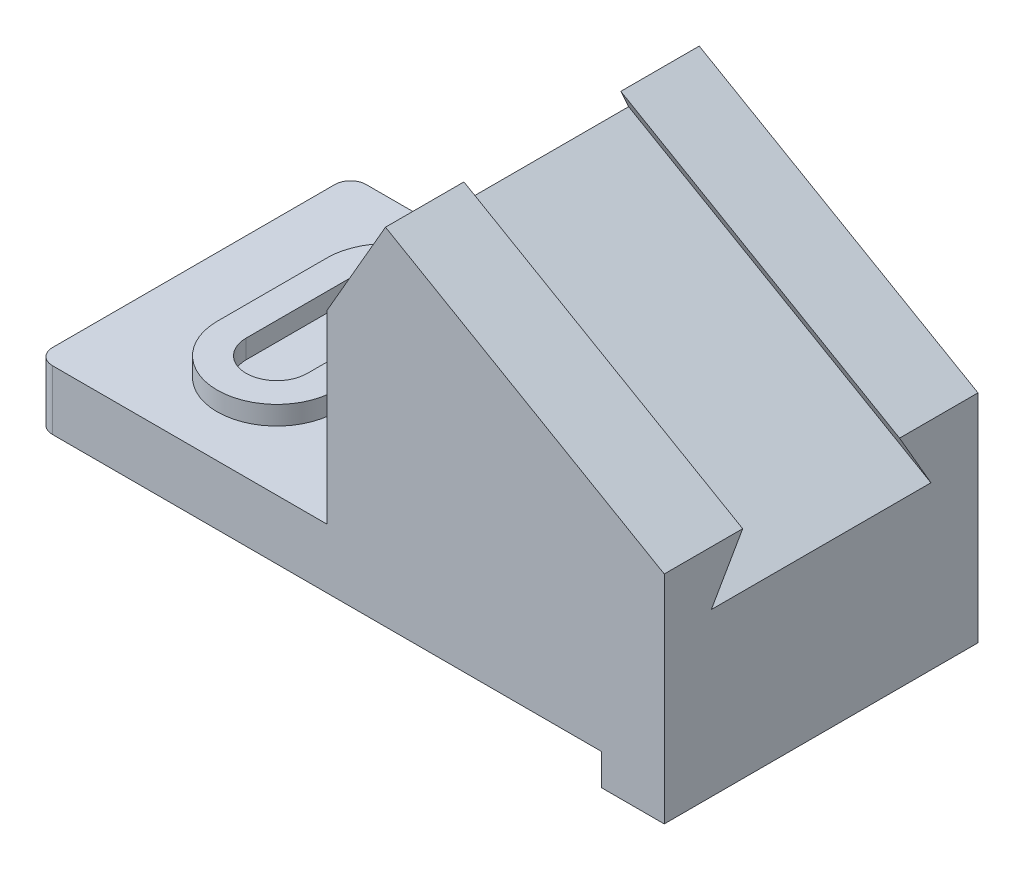
ISO-10303-21;
HEADER;
FILE_DESCRIPTION(('STEP AP214'),'2;1');
FILE_NAME('part.step','',(''),(''),'','','');
FILE_SCHEMA(('AUTOMOTIVE_DESIGN { 1 0 10303 214 1 1 1 1 }'));
ENDSEC;
DATA;
#1=APPLICATION_CONTEXT('core data for automotive mechanical design processes');
#2=APPLICATION_PROTOCOL_DEFINITION('international standard','automotive_design',2000,#1);
#3=PRODUCT_CONTEXT('',#1,'mechanical');
#4=PRODUCT('Part','Part','',(#3));
#5=PRODUCT_RELATED_PRODUCT_CATEGORY('part','',(#4));
#6=PRODUCT_DEFINITION_FORMATION('','',#4);
#7=PRODUCT_DEFINITION_CONTEXT('part definition',#1,'design');
#8=PRODUCT_DEFINITION('design','',#6,#7);
#9=PRODUCT_DEFINITION_SHAPE('','',#8);
#10=(LENGTH_UNIT() NAMED_UNIT(*) SI_UNIT(.MILLI.,.METRE.));
#11=(NAMED_UNIT(*) PLANE_ANGLE_UNIT() SI_UNIT($,.RADIAN.));
#12=(NAMED_UNIT(*) SI_UNIT($,.STERADIAN.) SOLID_ANGLE_UNIT());
#13=UNCERTAINTY_MEASURE_WITH_UNIT(LENGTH_MEASURE(1.E-05),#10,'distance_accuracy_value','');
#14=(GEOMETRIC_REPRESENTATION_CONTEXT(3) GLOBAL_UNCERTAINTY_ASSIGNED_CONTEXT((#13)) GLOBAL_UNIT_ASSIGNED_CONTEXT((#10,
#11,#12)) REPRESENTATION_CONTEXT('',''));
#15=CARTESIAN_POINT('',(0.,0.,0.));
#16=DIRECTION('',(0.,0.,1.));
#17=DIRECTION('',(1.,0.,0.));
#18=AXIS2_PLACEMENT_3D('',#15,#16,#17);
#19=CARTESIAN_POINT('',(185.,38.,200.));
#20=DIRECTION('',(0.,-1.,0.));
#21=DIRECTION('',(1.,0.,0.));
#22=AXIS2_PLACEMENT_3D('',#19,#20,#21);
#23=PLANE('',#22);
#24=DIRECTION('',(-1.,0.,0.));
#25=VECTOR('',#24,1.);
#26=CARTESIAN_POINT('',(185.,38.,0.));
#27=LINE('',#26,#25);
#28=CARTESIAN_POINT('',(185.,38.,0.));
#29=VERTEX_POINT('',#28);
#30=CARTESIAN_POINT('',(10.,38.,0.));
#31=VERTEX_POINT('',#30);
#32=EDGE_CURVE('E338',#29,#31,#27,.T.);
#33=ORIENTED_EDGE('',*,*,#32,.T.);
#34=CARTESIAN_POINT('',(10.,38.,10.));
#35=DIRECTION('',(0.,-1.,0.));
#36=DIRECTION('',(1.,0.,0.));
#37=AXIS2_PLACEMENT_3D('',#34,#35,#36);
#38=CIRCLE('',#37,10.);
#39=CARTESIAN_POINT('',(0.,38.,10.));
#40=VERTEX_POINT('',#39);
#41=EDGE_CURVE('E56',#31,#40,#38,.F.);
#42=ORIENTED_EDGE('',*,*,#41,.T.);
#43=DIRECTION('',(0.,0.,-1.));
#44=VECTOR('',#43,1.);
#45=CARTESIAN_POINT('',(0.,38.,200.));
#46=LINE('',#45,#44);
#47=CARTESIAN_POINT('',(0.,38.,190.));
#48=VERTEX_POINT('',#47);
#49=EDGE_CURVE('E360',#48,#40,#46,.T.);
#50=ORIENTED_EDGE('',*,*,#49,.F.);
#51=CARTESIAN_POINT('',(10.,38.,190.));
#52=DIRECTION('',(0.,-1.,0.));
#53=DIRECTION('',(1.,0.,0.));
#54=AXIS2_PLACEMENT_3D('',#51,#52,#53);
#55=CIRCLE('',#54,10.);
#56=CARTESIAN_POINT('',(10.,38.,200.));
#57=VERTEX_POINT('',#56);
#58=EDGE_CURVE('E439',#48,#57,#55,.F.);
#59=ORIENTED_EDGE('',*,*,#58,.T.);
#60=DIRECTION('',(-1.,0.,0.));
#61=VECTOR('',#60,1.);
#62=CARTESIAN_POINT('',(185.,38.,200.));
#63=LINE('',#62,#61);
#64=CARTESIAN_POINT('',(185.,38.,200.));
#65=VERTEX_POINT('',#64);
#66=EDGE_CURVE('E356',#65,#57,#63,.T.);
#67=ORIENTED_EDGE('',*,*,#66,.F.);
#68=DIRECTION('',(0.,0.,-1.));
#69=VECTOR('',#68,1.);
#70=CARTESIAN_POINT('',(185.,38.,200.));
#71=LINE('',#70,#69);
#72=EDGE_CURVE('E389',#65,#29,#71,.T.);
#73=ORIENTED_EDGE('',*,*,#72,.T.);
#74=EDGE_LOOP('',(#33,#42,#50,#59,#67,#73));
#75=FACE_BOUND('',#74,.T.);
#76=CARTESIAN_POINT('',(88.,38.,135.));
#77=DIRECTION('',(0.,1.,0.));
#78=DIRECTION('',(-1.,0.,0.));
#79=AXIS2_PLACEMENT_3D('',#76,#77,#78);
#80=CIRCLE('',#79,38.);
#81=CARTESIAN_POINT('',(50.,38.,135.));
#82=VERTEX_POINT('',#81);
#83=CARTESIAN_POINT('',(126.,38.,135.));
#84=VERTEX_POINT('',#83);
#85=EDGE_CURVE('E222',#82,#84,#80,.T.);
#86=ORIENTED_EDGE('',*,*,#85,.F.);
#87=DIRECTION('',(0.,0.,1.));
#88=VECTOR('',#87,1.);
#89=CARTESIAN_POINT('',(50.,38.,135.));
#90=LINE('',#89,#88);
#91=CARTESIAN_POINT('',(50.,38.,65.));
#92=VERTEX_POINT('',#91);
#93=EDGE_CURVE('E263',#92,#82,#90,.T.);
#94=ORIENTED_EDGE('',*,*,#93,.F.);
#95=CARTESIAN_POINT('',(87.999999999999,38.,64.9999912642141));
#96=DIRECTION('',(0.,1.,0.));
#97=DIRECTION('',(-1.,0.,0.));
#98=AXIS2_PLACEMENT_3D('',#95,#96,#97);
#99=CIRCLE('',#98,38.);
#100=CARTESIAN_POINT('',(125.999999999999,38.,64.9999912642141));
#101=VERTEX_POINT('',#100);
#102=EDGE_CURVE('E68',#101,#92,#99,.T.);
#103=ORIENTED_EDGE('',*,*,#102,.F.);
#104=DIRECTION('',(0.,0.,-1.));
#105=VECTOR('',#104,1.);
#106=CARTESIAN_POINT('',(126.,38.,135.));
#107=LINE('',#106,#105);
#108=EDGE_CURVE('E63',#84,#101,#107,.T.);
#109=ORIENTED_EDGE('',*,*,#108,.F.);
#110=EDGE_LOOP('',(#86,#94,#103,#109));
#111=FACE_BOUND('',#110,.T.);
#112=ADVANCED_FACE('F47',(#75,#111),#23,.F.);
#113=CARTESIAN_POINT('',(400.,118.,200.));
#114=DIRECTION('',(-0.499999999999998,-0.86602540378444,0.));
#115=DIRECTION('',(0.86602540378444,-0.499999999999998,0.));
#116=AXIS2_PLACEMENT_3D('',#113,#114,#115);
#117=PLANE('',#116);
#118=DIRECTION('',(0.,0.,-1.));
#119=VECTOR('',#118,1.);
#120=CARTESIAN_POINT('',(222.295517328095,220.597730906827,200.));
#121=LINE('',#120,#119);
#122=CARTESIAN_POINT('',(222.295517328095,220.597730906827,50.));
#123=VERTEX_POINT('',#122);
#124=CARTESIAN_POINT('',(222.295517328095,220.597730906827,0.));
#125=VERTEX_POINT('',#124);
#126=EDGE_CURVE('E397',#123,#125,#121,.T.);
#127=ORIENTED_EDGE('',*,*,#126,.F.);
#128=DIRECTION('',(-0.86602540378444,0.499999999999998,0.));
#129=VECTOR('',#128,1.);
#130=CARTESIAN_POINT('',(459.755752861126,83.5000000000004,50.));
#131=LINE('',#130,#129);
#132=CARTESIAN_POINT('',(400.,118.,50.));
#133=VERTEX_POINT('',#132);
#134=EDGE_CURVE('E308',#133,#123,#131,.T.);
#135=ORIENTED_EDGE('',*,*,#134,.F.);
#136=DIRECTION('',(0.,0.,-1.));
#137=VECTOR('',#136,1.);
#138=CARTESIAN_POINT('',(400.,118.,200.));
#139=LINE('',#138,#137);
#140=CARTESIAN_POINT('',(400.,118.,0.));
#141=VERTEX_POINT('',#140);
#142=EDGE_CURVE('E402',#133,#141,#139,.T.);
#143=ORIENTED_EDGE('',*,*,#142,.T.);
#144=DIRECTION('',(-0.86602540378444,0.499999999999998,0.));
#145=VECTOR('',#144,1.);
#146=CARTESIAN_POINT('',(400.,118.,0.));
#147=LINE('',#146,#145);
#148=EDGE_CURVE('E373',#141,#125,#147,.T.);
#149=ORIENTED_EDGE('',*,*,#148,.T.);
#150=EDGE_LOOP('',(#127,#135,#143,#149));
#151=FACE_BOUND('',#150,.T.);
#152=ADVANCED_FACE('F499',(#151),#117,.F.);
#153=CARTESIAN_POINT('',(0.,38.,200.));
#154=DIRECTION('',(1.,0.,0.));
#155=DIRECTION('',(0.,1.,0.));
#156=AXIS2_PLACEMENT_3D('',#153,#154,#155);
#157=PLANE('',#156);
#158=ORIENTED_EDGE('',*,*,#49,.T.);
#159=DIRECTION('',(0.,-1.,0.));
#160=VECTOR('',#159,1.);
#161=CARTESIAN_POINT('',(0.,38.,10.));
#162=LINE('',#161,#160);
#163=CARTESIAN_POINT('',(0.,0.,10.));
#164=VERTEX_POINT('',#163);
#165=EDGE_CURVE('E426',#40,#164,#162,.T.);
#166=ORIENTED_EDGE('',*,*,#165,.T.);
#167=DIRECTION('',(0.,0.,-1.));
#168=VECTOR('',#167,1.);
#169=CARTESIAN_POINT('',(0.,0.,200.));
#170=LINE('',#169,#168);
#171=CARTESIAN_POINT('',(0.,0.,190.));
#172=VERTEX_POINT('',#171);
#173=EDGE_CURVE('E419',#172,#164,#170,.T.);
#174=ORIENTED_EDGE('',*,*,#173,.F.);
#175=DIRECTION('',(0.,-1.,0.));
#176=VECTOR('',#175,1.);
#177=CARTESIAN_POINT('',(0.,38.,190.));
#178=LINE('',#177,#176);
#179=EDGE_CURVE('E423',#172,#48,#178,.F.);
#180=ORIENTED_EDGE('',*,*,#179,.T.);
#181=EDGE_LOOP('',(#158,#166,#174,#180));
#182=FACE_BOUND('',#181,.T.);
#183=ADVANCED_FACE('F453',(#182),#157,.F.);
#184=CARTESIAN_POINT('',(0.,0.,200.));
#185=DIRECTION('',(0.,1.,0.));
#186=DIRECTION('',(0.,0.,1.));
#187=AXIS2_PLACEMENT_3D('',#184,#185,#186);
#188=PLANE('',#187);
#189=ORIENTED_EDGE('',*,*,#173,.T.);
#190=CARTESIAN_POINT('',(10.,0.,10.));
#191=DIRECTION('',(0.,1.,0.));
#192=DIRECTION('',(0.,0.,1.));
#193=AXIS2_PLACEMENT_3D('',#190,#191,#192);
#194=CIRCLE('',#193,10.);
#195=CARTESIAN_POINT('',(10.,0.,0.));
#196=VERTEX_POINT('',#195);
#197=EDGE_CURVE('E433',#164,#196,#194,.F.);
#198=ORIENTED_EDGE('',*,*,#197,.T.);
#199=DIRECTION('',(1.,0.,0.));
#200=VECTOR('',#199,1.);
#201=CARTESIAN_POINT('',(0.,0.,0.));
#202=LINE('',#201,#200);
#203=CARTESIAN_POINT('',(360.,0.,0.));
#204=VERTEX_POINT('',#203);
#205=EDGE_CURVE('E333',#196,#204,#202,.T.);
#206=ORIENTED_EDGE('',*,*,#205,.T.);
#207=DIRECTION('',(0.,0.,-1.));
#208=VECTOR('',#207,1.);
#209=CARTESIAN_POINT('',(360.,0.,200.));
#210=LINE('',#209,#208);
#211=CARTESIAN_POINT('',(360.,0.,200.));
#212=VERTEX_POINT('',#211);
#213=EDGE_CURVE('E415',#212,#204,#210,.T.);
#214=ORIENTED_EDGE('',*,*,#213,.F.);
#215=DIRECTION('',(1.,0.,0.));
#216=VECTOR('',#215,1.);
#217=CARTESIAN_POINT('',(0.,0.,200.));
#218=LINE('',#217,#216);
#219=CARTESIAN_POINT('',(10.,0.,200.));
#220=VERTEX_POINT('',#219);
#221=EDGE_CURVE('E334',#220,#212,#218,.T.);
#222=ORIENTED_EDGE('',*,*,#221,.F.);
#223=CARTESIAN_POINT('',(10.,0.,190.));
#224=DIRECTION('',(0.,1.,0.));
#225=DIRECTION('',(0.,0.,1.));
#226=AXIS2_PLACEMENT_3D('',#223,#224,#225);
#227=CIRCLE('',#226,10.);
#228=EDGE_CURVE('E430',#220,#172,#227,.F.);
#229=ORIENTED_EDGE('',*,*,#228,.T.);
#230=EDGE_LOOP('',(#189,#198,#206,#214,#222,#229));
#231=FACE_BOUND('',#230,.T.);
#232=ADVANCED_FACE('F459',(#231),#188,.F.);
#233=CARTESIAN_POINT('',(360.,0.,200.));
#234=DIRECTION('',(1.,0.,0.));
#235=DIRECTION('',(0.,0.,-1.));
#236=AXIS2_PLACEMENT_3D('',#233,#234,#235);
#237=PLANE('',#236);
#238=DIRECTION('',(0.,-1.,0.));
#239=VECTOR('',#238,1.);
#240=CARTESIAN_POINT('',(360.,0.,0.));
#241=LINE('',#240,#239);
#242=CARTESIAN_POINT('',(360.,-19.9999999999999,0.));
#243=VERTEX_POINT('',#242);
#244=EDGE_CURVE('E363',#204,#243,#241,.T.);
#245=ORIENTED_EDGE('',*,*,#244,.T.);
#246=DIRECTION('',(0.,0.,-1.));
#247=VECTOR('',#246,1.);
#248=CARTESIAN_POINT('',(360.,-19.9999999999999,200.));
#249=LINE('',#248,#247);
#250=CARTESIAN_POINT('',(360.,-19.9999999999999,200.));
#251=VERTEX_POINT('',#250);
#252=EDGE_CURVE('E411',#251,#243,#249,.T.);
#253=ORIENTED_EDGE('',*,*,#252,.F.);
#254=DIRECTION('',(0.,-1.,0.));
#255=VECTOR('',#254,1.);
#256=CARTESIAN_POINT('',(360.,0.,200.));
#257=LINE('',#256,#255);
#258=EDGE_CURVE('E337',#212,#251,#257,.T.);
#259=ORIENTED_EDGE('',*,*,#258,.F.);
#260=ORIENTED_EDGE('',*,*,#213,.T.);
#261=EDGE_LOOP('',(#245,#253,#259,#260));
#262=FACE_BOUND('',#261,.T.);
#263=ADVANCED_FACE('F468',(#262),#237,.F.);
#264=CARTESIAN_POINT('',(360.,-19.9999999999999,200.));
#265=DIRECTION('',(0.,1.,0.));
#266=DIRECTION('',(0.,0.,1.));
#267=AXIS2_PLACEMENT_3D('',#264,#265,#266);
#268=PLANE('',#267);
#269=DIRECTION('',(1.,0.,0.));
#270=VECTOR('',#269,1.);
#271=CARTESIAN_POINT('',(360.,-19.9999999999999,0.));
#272=LINE('',#271,#270);
#273=CARTESIAN_POINT('',(400.,-19.9999999999999,0.));
#274=VERTEX_POINT('',#273);
#275=EDGE_CURVE('E366',#243,#274,#272,.T.);
#276=ORIENTED_EDGE('',*,*,#275,.T.);
#277=DIRECTION('',(0.,0.,-1.));
#278=VECTOR('',#277,1.);
#279=CARTESIAN_POINT('',(400.,-19.9999999999999,200.));
#280=LINE('',#279,#278);
#281=CARTESIAN_POINT('',(400.,-19.9999999999999,200.));
#282=VERTEX_POINT('',#281);
#283=EDGE_CURVE('E407',#282,#274,#280,.T.);
#284=ORIENTED_EDGE('',*,*,#283,.F.);
#285=DIRECTION('',(1.,0.,0.));
#286=VECTOR('',#285,1.);
#287=CARTESIAN_POINT('',(360.,-19.9999999999999,200.));
#288=LINE('',#287,#286);
#289=EDGE_CURVE('E341',#251,#282,#288,.T.);
#290=ORIENTED_EDGE('',*,*,#289,.F.);
#291=ORIENTED_EDGE('',*,*,#252,.T.);
#292=EDGE_LOOP('',(#276,#284,#290,#291));
#293=FACE_BOUND('',#292,.T.);
#294=ADVANCED_FACE('F472',(#293),#268,.F.);
#295=CARTESIAN_POINT('',(400.,-19.9999999999999,200.));
#296=DIRECTION('',(-1.,0.,0.));
#297=DIRECTION('',(0.,0.,1.));
#298=AXIS2_PLACEMENT_3D('',#295,#296,#297);
#299=PLANE('',#298);
#300=ORIENTED_EDGE('',*,*,#142,.F.);
#301=DIRECTION('',(0.,-0.866025403784438,-0.500000000000002));
#302=VECTOR('',#301,1.);
#303=CARTESIAN_POINT('',(400.,79.4519052838334,27.7442471388738));
#304=LINE('',#303,#302);
#305=CARTESIAN_POINT('',(400.,83.3589838486227,30.));
#306=VERTEX_POINT('',#305);
#307=EDGE_CURVE('E329',#133,#306,#304,.T.);
#308=ORIENTED_EDGE('',*,*,#307,.T.);
#309=DIRECTION('',(0.,0.,1.));
#310=VECTOR('',#309,1.);
#311=CARTESIAN_POINT('',(400.,83.3589838486227,200.));
#312=LINE('',#311,#310);
#313=CARTESIAN_POINT('',(400.,83.3589838486227,170.));
#314=VERTEX_POINT('',#313);
#315=EDGE_CURVE('E311',#306,#314,#312,.T.);
#316=ORIENTED_EDGE('',*,*,#315,.T.);
#317=DIRECTION('',(0.,0.866025403784438,-0.500000000000001));
#318=VECTOR('',#317,1.);
#319=CARTESIAN_POINT('',(400.,-7.15063509461077,222.255752861126));
#320=LINE('',#319,#318);
#321=CARTESIAN_POINT('',(400.,118.,150.));
#322=VERTEX_POINT('',#321);
#323=EDGE_CURVE('E325',#314,#322,#320,.T.);
#324=ORIENTED_EDGE('',*,*,#323,.T.);
#325=CARTESIAN_POINT('',(400.,118.,200.));
#326=VERTEX_POINT('',#325);
#327=EDGE_CURVE('E403',#326,#322,#139,.T.);
#328=ORIENTED_EDGE('',*,*,#327,.F.);
#329=DIRECTION('',(0.,1.,0.));
#330=VECTOR('',#329,1.);
#331=CARTESIAN_POINT('',(400.,-19.9999999999999,200.));
#332=LINE('',#331,#330);
#333=EDGE_CURVE('E344',#282,#326,#332,.T.);
#334=ORIENTED_EDGE('',*,*,#333,.F.);
#335=ORIENTED_EDGE('',*,*,#283,.T.);
#336=DIRECTION('',(0.,1.,0.));
#337=VECTOR('',#336,1.);
#338=CARTESIAN_POINT('',(400.,-19.9999999999999,0.));
#339=LINE('',#338,#337);
#340=EDGE_CURVE('E369',#274,#141,#339,.T.);
#341=ORIENTED_EDGE('',*,*,#340,.T.);
#342=EDGE_LOOP('',(#300,#308,#316,#324,#328,#334,#335,#341));
#343=FACE_BOUND('',#342,.T.);
#344=ADVANCED_FACE('F503',(#343),#299,.F.);
#345=ORIENTED_EDGE('',*,*,#327,.T.);
#346=DIRECTION('',(-0.86602540378444,0.499999999999998,0.));
#347=VECTOR('',#346,1.);
#348=CARTESIAN_POINT('',(459.755752861126,83.5000000000005,150.));
#349=LINE('',#348,#347);
#350=CARTESIAN_POINT('',(222.295517328096,220.597730906827,150.));
#351=VERTEX_POINT('',#350);
#352=EDGE_CURVE('E312',#322,#351,#349,.T.);
#353=ORIENTED_EDGE('',*,*,#352,.T.);
#354=CARTESIAN_POINT('',(222.295517328095,220.597730906827,200.));
#355=VERTEX_POINT('',#354);
#356=EDGE_CURVE('E398',#355,#351,#121,.T.);
#357=ORIENTED_EDGE('',*,*,#356,.F.);
#358=DIRECTION('',(-0.86602540378444,0.499999999999998,0.));
#359=VECTOR('',#358,1.);
#360=CARTESIAN_POINT('',(400.,118.,200.));
#361=LINE('',#360,#359);
#362=EDGE_CURVE('E347',#326,#355,#361,.T.);
#363=ORIENTED_EDGE('',*,*,#362,.F.);
#364=EDGE_LOOP('',(#345,#353,#357,#363));
#365=FACE_BOUND('',#364,.T.);
#366=ADVANCED_FACE('F507',(#365),#117,.F.);
#367=CARTESIAN_POINT('',(222.295517328095,220.597730906827,200.));
#368=DIRECTION('',(0.86602540378444,-0.499999999999997,0.));
#369=DIRECTION('',(0.499999999999997,0.86602540378444,0.));
#370=AXIS2_PLACEMENT_3D('',#367,#368,#369);
#371=PLANE('',#370);
#372=DIRECTION('',(0.,0.,1.));
#373=VECTOR('',#372,1.);
#374=CARTESIAN_POINT('',(207.295517328096,194.616968793294,30.));
#375=LINE('',#374,#373);
#376=CARTESIAN_POINT('',(207.295517328095,194.616968793294,30.));
#377=VERTEX_POINT('',#376);
#378=CARTESIAN_POINT('',(207.295517328096,194.616968793294,170.));
#379=VERTEX_POINT('',#378);
#380=EDGE_CURVE('E300',#377,#379,#375,.T.);
#381=ORIENTED_EDGE('',*,*,#380,.F.);
#382=DIRECTION('',(-0.416025147168919,-0.720576692122893,-0.55470019622523));
#383=VECTOR('',#382,1.);
#384=CARTESIAN_POINT('',(222.295517328095,220.597730906827,50.));
#385=LINE('',#384,#383);
#386=EDGE_CURVE('E297',#123,#377,#385,.T.);
#387=ORIENTED_EDGE('',*,*,#386,.F.);
#388=ORIENTED_EDGE('',*,*,#126,.T.);
#389=DIRECTION('',(-0.499999999999997,-0.86602540378444,0.));
#390=VECTOR('',#389,1.);
#391=CARTESIAN_POINT('',(222.295517328095,220.597730906827,0.));
#392=LINE('',#391,#390);
#393=CARTESIAN_POINT('',(185.,156.,0.));
#394=VERTEX_POINT('',#393);
#395=EDGE_CURVE('E377',#125,#394,#392,.T.);
#396=ORIENTED_EDGE('',*,*,#395,.T.);
#397=DIRECTION('',(0.,0.,-1.));
#398=VECTOR('',#397,1.);
#399=CARTESIAN_POINT('',(185.,156.,200.));
#400=LINE('',#399,#398);
#401=CARTESIAN_POINT('',(185.,156.,200.));
#402=VERTEX_POINT('',#401);
#403=EDGE_CURVE('E393',#402,#394,#400,.T.);
#404=ORIENTED_EDGE('',*,*,#403,.F.);
#405=DIRECTION('',(-0.499999999999997,-0.86602540378444,0.));
#406=VECTOR('',#405,1.);
#407=CARTESIAN_POINT('',(222.295517328095,220.597730906827,200.));
#408=LINE('',#407,#406);
#409=EDGE_CURVE('E350',#355,#402,#408,.T.);
#410=ORIENTED_EDGE('',*,*,#409,.F.);
#411=ORIENTED_EDGE('',*,*,#356,.T.);
#412=DIRECTION('',(0.41602514716892,0.720576692122893,-0.554700196225229));
#413=VECTOR('',#412,1.);
#414=CARTESIAN_POINT('',(222.295517328096,220.597730906827,150.));
#415=LINE('',#414,#413);
#416=EDGE_CURVE('E304',#379,#351,#415,.T.);
#417=ORIENTED_EDGE('',*,*,#416,.F.);
#418=EDGE_LOOP('',(#381,#387,#388,#396,#404,#410,#411,#417));
#419=FACE_BOUND('',#418,.T.);
#420=ADVANCED_FACE('F493',(#419),#371,.F.);
#421=CARTESIAN_POINT('',(185.,156.,200.));
#422=DIRECTION('',(1.,0.,0.));
#423=DIRECTION('',(0.,0.,-1.));
#424=AXIS2_PLACEMENT_3D('',#421,#422,#423);
#425=PLANE('',#424);
#426=DIRECTION('',(0.,-1.,0.));
#427=VECTOR('',#426,1.);
#428=CARTESIAN_POINT('',(185.,156.,0.));
#429=LINE('',#428,#427);
#430=EDGE_CURVE('E380',#394,#29,#429,.T.);
#431=ORIENTED_EDGE('',*,*,#430,.T.);
#432=ORIENTED_EDGE('',*,*,#72,.F.);
#433=DIRECTION('',(0.,-1.,0.));
#434=VECTOR('',#433,1.);
#435=CARTESIAN_POINT('',(185.,156.,200.));
#436=LINE('',#435,#434);
#437=EDGE_CURVE('E353',#402,#65,#436,.T.);
#438=ORIENTED_EDGE('',*,*,#437,.F.);
#439=ORIENTED_EDGE('',*,*,#403,.T.);
#440=EDGE_LOOP('',(#431,#432,#438,#439));
#441=FACE_BOUND('',#440,.T.);
#442=ADVANCED_FACE('F487',(#441),#425,.F.);
#443=CARTESIAN_POINT('',(0.,0.,200.));
#444=DIRECTION('',(0.,0.,1.));
#445=DIRECTION('',(1.,0.,0.));
#446=AXIS2_PLACEMENT_3D('',#443,#444,#445);
#447=PLANE('',#446);
#448=ORIENTED_EDGE('',*,*,#66,.T.);
#449=DIRECTION('',(0.,-1.,0.));
#450=VECTOR('',#449,1.);
#451=CARTESIAN_POINT('',(10.,0.,200.));
#452=LINE('',#451,#450);
#453=EDGE_CURVE('E11',#57,#220,#452,.T.);
#454=ORIENTED_EDGE('',*,*,#453,.T.);
#455=ORIENTED_EDGE('',*,*,#221,.T.);
#456=ORIENTED_EDGE('',*,*,#258,.T.);
#457=ORIENTED_EDGE('',*,*,#289,.T.);
#458=ORIENTED_EDGE('',*,*,#333,.T.);
#459=ORIENTED_EDGE('',*,*,#362,.T.);
#460=ORIENTED_EDGE('',*,*,#409,.T.);
#461=ORIENTED_EDGE('',*,*,#437,.T.);
#462=EDGE_LOOP('',(#448,#454,#455,#456,#457,#458,#459,#460,#461));
#463=FACE_BOUND('',#462,.T.);
#464=ADVANCED_FACE('F476',(#463),#447,.T.);
#465=CARTESIAN_POINT('',(0.,0.,0.));
#466=DIRECTION('',(0.,0.,1.));
#467=DIRECTION('',(1.,0.,0.));
#468=AXIS2_PLACEMENT_3D('',#465,#466,#467);
#469=PLANE('',#468);
#470=ORIENTED_EDGE('',*,*,#205,.F.);
#471=DIRECTION('',(0.,-1.,0.));
#472=VECTOR('',#471,1.);
#473=CARTESIAN_POINT('',(10.,0.,0.));
#474=LINE('',#473,#472);
#475=EDGE_CURVE('E436',#196,#31,#474,.F.);
#476=ORIENTED_EDGE('',*,*,#475,.T.);
#477=ORIENTED_EDGE('',*,*,#32,.F.);
#478=ORIENTED_EDGE('',*,*,#430,.F.);
#479=ORIENTED_EDGE('',*,*,#395,.F.);
#480=ORIENTED_EDGE('',*,*,#148,.F.);
#481=ORIENTED_EDGE('',*,*,#340,.F.);
#482=ORIENTED_EDGE('',*,*,#275,.F.);
#483=ORIENTED_EDGE('',*,*,#244,.F.);
#484=EDGE_LOOP('',(#470,#476,#477,#478,#479,#480,#481,#482,#483));
#485=FACE_BOUND('',#484,.T.);
#486=ADVANCED_FACE('F463',(#485),#469,.F.);
#487=CARTESIAN_POINT('',(459.755752861126,83.5000000000004,50.));
#488=DIRECTION('',(0.277350098112614,0.480384461415263,-0.832050294337843));
#489=DIRECTION('',(0.,0.866025403784438,0.500000000000002));
#490=AXIS2_PLACEMENT_3D('',#487,#488,#489);
#491=PLANE('',#490);
#492=ORIENTED_EDGE('',*,*,#134,.T.);
#493=ORIENTED_EDGE('',*,*,#386,.T.);
#494=DIRECTION('',(-0.86602540378444,0.499999999999998,0.));
#495=VECTOR('',#494,1.);
#496=CARTESIAN_POINT('',(444.755752861126,57.5192378864673,30.));
#497=LINE('',#496,#495);
#498=EDGE_CURVE('E307',#306,#377,#497,.T.);
#499=ORIENTED_EDGE('',*,*,#498,.F.);
#500=ORIENTED_EDGE('',*,*,#307,.F.);
#501=EDGE_LOOP('',(#492,#493,#499,#500));
#502=FACE_BOUND('',#501,.T.);
#503=ADVANCED_FACE('F516',(#502),#491,.F.);
#504=CARTESIAN_POINT('',(459.755752861126,83.5000000000005,150.));
#505=DIRECTION('',(0.277350098112613,0.480384461415262,0.832050294337843));
#506=DIRECTION('',(0.,-0.866025403784438,0.500000000000001));
#507=AXIS2_PLACEMENT_3D('',#504,#505,#506);
#508=PLANE('',#507);
#509=DIRECTION('',(-0.86602540378444,0.499999999999998,0.));
#510=VECTOR('',#509,1.);
#511=CARTESIAN_POINT('',(444.755752861126,57.5192378864673,170.));
#512=LINE('',#511,#510);
#513=EDGE_CURVE('E316',#314,#379,#512,.T.);
#514=ORIENTED_EDGE('',*,*,#513,.T.);
#515=ORIENTED_EDGE('',*,*,#416,.T.);
#516=ORIENTED_EDGE('',*,*,#352,.F.);
#517=ORIENTED_EDGE('',*,*,#323,.F.);
#518=EDGE_LOOP('',(#514,#515,#516,#517));
#519=FACE_BOUND('',#518,.T.);
#520=ADVANCED_FACE('F510',(#519),#508,.F.);
#521=CARTESIAN_POINT('',(444.755752861126,57.5192378864673,30.));
#522=DIRECTION('',(-0.499999999999998,-0.86602540378444,0.));
#523=DIRECTION('',(0.86602540378444,-0.499999999999998,0.));
#524=AXIS2_PLACEMENT_3D('',#521,#522,#523);
#525=PLANE('',#524);
#526=ORIENTED_EDGE('',*,*,#498,.T.);
#527=ORIENTED_EDGE('',*,*,#380,.T.);
#528=ORIENTED_EDGE('',*,*,#513,.F.);
#529=ORIENTED_EDGE('',*,*,#315,.F.);
#530=EDGE_LOOP('',(#526,#527,#528,#529));
#531=FACE_BOUND('',#530,.T.);
#532=ADVANCED_FACE('F513',(#531),#525,.F.);
#533=CARTESIAN_POINT('',(10.,38.,10.));
#534=DIRECTION('',(0.,-1.,0.));
#535=DIRECTION('',(1.,0.,0.));
#536=AXIS2_PLACEMENT_3D('',#533,#534,#535);
#537=CYLINDRICAL_SURFACE('',#536,10.);
#538=ORIENTED_EDGE('',*,*,#41,.F.);
#539=ORIENTED_EDGE('',*,*,#475,.F.);
#540=ORIENTED_EDGE('',*,*,#197,.F.);
#541=ORIENTED_EDGE('',*,*,#165,.F.);
#542=EDGE_LOOP('',(#538,#539,#540,#541));
#543=FACE_BOUND('',#542,.T.);
#544=ADVANCED_FACE('F456',(#543),#537,.T.);
#545=CARTESIAN_POINT('',(10.,0.,190.));
#546=DIRECTION('',(0.,1.,0.));
#547=DIRECTION('',(-1.,0.,0.));
#548=AXIS2_PLACEMENT_3D('',#545,#546,#547);
#549=CYLINDRICAL_SURFACE('',#548,10.);
#550=ORIENTED_EDGE('',*,*,#58,.F.);
#551=ORIENTED_EDGE('',*,*,#179,.F.);
#552=ORIENTED_EDGE('',*,*,#228,.F.);
#553=ORIENTED_EDGE('',*,*,#453,.F.);
#554=EDGE_LOOP('',(#550,#551,#552,#553));
#555=FACE_BOUND('',#554,.T.);
#556=ADVANCED_FACE('F49',(#555),#549,.T.);
#557=CARTESIAN_POINT('',(88.,50.,135.));
#558=DIRECTION('',(0.,1.,0.));
#559=DIRECTION('',(-1.,0.,0.));
#560=AXIS2_PLACEMENT_3D('',#557,#558,#559);
#561=PLANE('',#560);
#562=CARTESIAN_POINT('',(88.,50.,135.));
#563=DIRECTION('',(0.,1.,0.));
#564=DIRECTION('',(-1.,0.,0.));
#565=AXIS2_PLACEMENT_3D('',#562,#563,#564);
#566=CIRCLE('',#565,38.);
#567=CARTESIAN_POINT('',(50.,50.,135.));
#568=VERTEX_POINT('',#567);
#569=CARTESIAN_POINT('',(126.,50.,135.));
#570=VERTEX_POINT('',#569);
#571=EDGE_CURVE('E258',#568,#570,#566,.T.);
#572=ORIENTED_EDGE('',*,*,#571,.T.);
#573=DIRECTION('',(0.,0.,-1.));
#574=VECTOR('',#573,1.);
#575=CARTESIAN_POINT('',(126.,50.,135.));
#576=LINE('',#575,#574);
#577=CARTESIAN_POINT('',(125.999999999999,50.,64.9999912642141));
#578=VERTEX_POINT('',#577);
#579=EDGE_CURVE('E262',#570,#578,#576,.T.);
#580=ORIENTED_EDGE('',*,*,#579,.T.);
#581=CARTESIAN_POINT('',(87.999999999999,50.,64.9999912642141));
#582=DIRECTION('',(0.,1.,0.));
#583=DIRECTION('',(-1.,0.,0.));
#584=AXIS2_PLACEMENT_3D('',#581,#582,#583);
#585=CIRCLE('',#584,38.);
#586=CARTESIAN_POINT('',(50.,50.,65.));
#587=VERTEX_POINT('',#586);
#588=EDGE_CURVE('E266',#578,#587,#585,.T.);
#589=ORIENTED_EDGE('',*,*,#588,.T.);
#590=DIRECTION('',(0.,0.,1.));
#591=VECTOR('',#590,1.);
#592=CARTESIAN_POINT('',(50.,50.,135.));
#593=LINE('',#592,#591);
#594=EDGE_CURVE('E269',#587,#568,#593,.T.);
#595=ORIENTED_EDGE('',*,*,#594,.T.);
#596=EDGE_LOOP('',(#572,#580,#589,#595));
#597=FACE_BOUND('',#596,.T.);
#598=DIRECTION('',(0.,0.,-1.));
#599=VECTOR('',#598,1.);
#600=CARTESIAN_POINT('',(107.5,50.,135.));
#601=LINE('',#600,#599);
#602=CARTESIAN_POINT('',(107.5,50.,135.));
#603=VERTEX_POINT('',#602);
#604=CARTESIAN_POINT('',(107.5,50.,64.9999912642141));
#605=VERTEX_POINT('',#604);
#606=EDGE_CURVE('E213',#603,#605,#601,.T.);
#607=ORIENTED_EDGE('',*,*,#606,.F.);
#608=CARTESIAN_POINT('',(88.,50.,135.));
#609=DIRECTION('',(0.,1.,0.));
#610=DIRECTION('',(-1.,0.,0.));
#611=AXIS2_PLACEMENT_3D('',#608,#609,#610);
#612=CIRCLE('',#611,19.5);
#613=CARTESIAN_POINT('',(68.5,50.,135.));
#614=VERTEX_POINT('',#613);
#615=EDGE_CURVE('E202',#614,#603,#612,.T.);
#616=ORIENTED_EDGE('',*,*,#615,.F.);
#617=DIRECTION('',(0.,0.,1.));
#618=VECTOR('',#617,1.);
#619=CARTESIAN_POINT('',(68.5,50.,135.));
#620=LINE('',#619,#618);
#621=CARTESIAN_POINT('',(68.5,50.,65.));
#622=VERTEX_POINT('',#621);
#623=EDGE_CURVE('E234',#622,#614,#620,.T.);
#624=ORIENTED_EDGE('',*,*,#623,.F.);
#625=CARTESIAN_POINT('',(87.999999999999,50.,64.9999912642141));
#626=DIRECTION('',(0.,1.,0.));
#627=DIRECTION('',(-1.,0.,0.));
#628=AXIS2_PLACEMENT_3D('',#625,#626,#627);
#629=CIRCLE('',#628,19.500000000001);
#630=EDGE_CURVE('E228',#605,#622,#629,.T.);
#631=ORIENTED_EDGE('',*,*,#630,.F.);
#632=EDGE_LOOP('',(#607,#616,#624,#631));
#633=FACE_BOUND('',#632,.T.);
#634=ADVANCED_FACE('F226',(#597,#633),#561,.T.);
#635=CARTESIAN_POINT('',(88.,50.,135.));
#636=DIRECTION('',(0.,-1.,0.));
#637=DIRECTION('',(1.,0.,0.));
#638=AXIS2_PLACEMENT_3D('',#635,#636,#637);
#639=CYLINDRICAL_SURFACE('',#638,38.);
#640=ORIENTED_EDGE('',*,*,#85,.T.);
#641=DIRECTION('',(0.,-1.,0.));
#642=VECTOR('',#641,1.);
#643=CARTESIAN_POINT('',(126.,50.,135.));
#644=LINE('',#643,#642);
#645=EDGE_CURVE('E294',#570,#84,#644,.T.);
#646=ORIENTED_EDGE('',*,*,#645,.F.);
#647=ORIENTED_EDGE('',*,*,#571,.F.);
#648=DIRECTION('',(0.,-1.,0.));
#649=VECTOR('',#648,1.);
#650=CARTESIAN_POINT('',(50.,50.,135.));
#651=LINE('',#650,#649);
#652=EDGE_CURVE('E272',#568,#82,#651,.T.);
#653=ORIENTED_EDGE('',*,*,#652,.T.);
#654=EDGE_LOOP('',(#640,#646,#647,#653));
#655=FACE_BOUND('',#654,.T.);
#656=ADVANCED_FACE('F561',(#655),#639,.T.);
#657=CARTESIAN_POINT('',(126.,50.,135.));
#658=DIRECTION('',(-1.,0.,0.));
#659=DIRECTION('',(0.,0.,1.));
#660=AXIS2_PLACEMENT_3D('',#657,#658,#659);
#661=PLANE('',#660);
#662=ORIENTED_EDGE('',*,*,#108,.T.);
#663=DIRECTION('',(0.,-1.,0.));
#664=VECTOR('',#663,1.);
#665=CARTESIAN_POINT('',(125.999999999999,50.,64.9999912642141));
#666=LINE('',#665,#664);
#667=EDGE_CURVE('E290',#578,#101,#666,.T.);
#668=ORIENTED_EDGE('',*,*,#667,.F.);
#669=ORIENTED_EDGE('',*,*,#579,.F.);
#670=ORIENTED_EDGE('',*,*,#645,.T.);
#671=EDGE_LOOP('',(#662,#668,#669,#670));
#672=FACE_BOUND('',#671,.T.);
#673=ADVANCED_FACE('F569',(#672),#661,.F.);
#674=CARTESIAN_POINT('',(87.999999999999,50.,64.9999912642141));
#675=DIRECTION('',(0.,-1.,0.));
#676=DIRECTION('',(1.,0.,0.));
#677=AXIS2_PLACEMENT_3D('',#674,#675,#676);
#678=CYLINDRICAL_SURFACE('',#677,38.);
#679=ORIENTED_EDGE('',*,*,#102,.T.);
#680=DIRECTION('',(0.,-1.,0.));
#681=VECTOR('',#680,1.);
#682=CARTESIAN_POINT('',(50.,50.,65.));
#683=LINE('',#682,#681);
#684=EDGE_CURVE('E286',#587,#92,#683,.T.);
#685=ORIENTED_EDGE('',*,*,#684,.F.);
#686=ORIENTED_EDGE('',*,*,#588,.F.);
#687=ORIENTED_EDGE('',*,*,#667,.T.);
#688=EDGE_LOOP('',(#679,#685,#686,#687));
#689=FACE_BOUND('',#688,.T.);
#690=ADVANCED_FACE('F565',(#689),#678,.T.);
#691=CARTESIAN_POINT('',(50.,50.,135.));
#692=DIRECTION('',(1.,0.,0.));
#693=DIRECTION('',(0.,1.,0.));
#694=AXIS2_PLACEMENT_3D('',#691,#692,#693);
#695=PLANE('',#694);
#696=ORIENTED_EDGE('',*,*,#93,.T.);
#697=ORIENTED_EDGE('',*,*,#652,.F.);
#698=ORIENTED_EDGE('',*,*,#594,.F.);
#699=ORIENTED_EDGE('',*,*,#684,.T.);
#700=EDGE_LOOP('',(#696,#697,#698,#699));
#701=FACE_BOUND('',#700,.T.);
#702=ADVANCED_FACE('F559',(#701),#695,.F.);
#703=CARTESIAN_POINT('',(88.,50.,135.));
#704=DIRECTION('',(0.,-1.,0.));
#705=DIRECTION('',(1.,0.,0.));
#706=AXIS2_PLACEMENT_3D('',#703,#704,#705);
#707=CYLINDRICAL_SURFACE('',#706,19.5);
#708=CARTESIAN_POINT('',(88.,38.,135.));
#709=DIRECTION('',(0.,1.,0.));
#710=DIRECTION('',(-1.,0.,0.));
#711=AXIS2_PLACEMENT_3D('',#708,#709,#710);
#712=CIRCLE('',#711,19.5);
#713=CARTESIAN_POINT('',(68.5,38.,135.));
#714=VERTEX_POINT('',#713);
#715=CARTESIAN_POINT('',(107.5,38.,135.));
#716=VERTEX_POINT('',#715);
#717=EDGE_CURVE('E239',#714,#716,#712,.T.);
#718=ORIENTED_EDGE('',*,*,#717,.F.);
#719=DIRECTION('',(0.,-1.,0.));
#720=VECTOR('',#719,1.);
#721=CARTESIAN_POINT('',(68.5,50.,135.));
#722=LINE('',#721,#720);
#723=EDGE_CURVE('E208',#614,#714,#722,.T.);
#724=ORIENTED_EDGE('',*,*,#723,.F.);
#725=ORIENTED_EDGE('',*,*,#615,.T.);
#726=DIRECTION('',(0.,-1.,0.));
#727=VECTOR('',#726,1.);
#728=CARTESIAN_POINT('',(107.5,50.,135.));
#729=LINE('',#728,#727);
#730=EDGE_CURVE('E206',#603,#716,#729,.T.);
#731=ORIENTED_EDGE('',*,*,#730,.T.);
#732=EDGE_LOOP('',(#718,#724,#725,#731));
#733=FACE_BOUND('',#732,.T.);
#734=ADVANCED_FACE('F205',(#733),#707,.F.);
#735=CARTESIAN_POINT('',(107.5,50.,135.));
#736=DIRECTION('',(-1.,0.,0.));
#737=DIRECTION('',(0.,0.,1.));
#738=AXIS2_PLACEMENT_3D('',#735,#736,#737);
#739=PLANE('',#738);
#740=DIRECTION('',(0.,0.,-1.));
#741=VECTOR('',#740,1.);
#742=CARTESIAN_POINT('',(107.5,38.,135.));
#743=LINE('',#742,#741);
#744=CARTESIAN_POINT('',(107.5,38.,64.9999912642141));
#745=VERTEX_POINT('',#744);
#746=EDGE_CURVE('E220',#716,#745,#743,.T.);
#747=ORIENTED_EDGE('',*,*,#746,.F.);
#748=ORIENTED_EDGE('',*,*,#730,.F.);
#749=ORIENTED_EDGE('',*,*,#606,.T.);
#750=DIRECTION('',(0.,-1.,0.));
#751=VECTOR('',#750,1.);
#752=CARTESIAN_POINT('',(107.5,50.,64.9999912642141));
#753=LINE('',#752,#751);
#754=EDGE_CURVE('E223',#605,#745,#753,.T.);
#755=ORIENTED_EDGE('',*,*,#754,.T.);
#756=EDGE_LOOP('',(#747,#748,#749,#755));
#757=FACE_BOUND('',#756,.T.);
#758=ADVANCED_FACE('F217',(#757),#739,.T.);
#759=CARTESIAN_POINT('',(87.999999999999,50.,64.9999912642141));
#760=DIRECTION('',(0.,-1.,0.));
#761=DIRECTION('',(1.,0.,0.));
#762=AXIS2_PLACEMENT_3D('',#759,#760,#761);
#763=CYLINDRICAL_SURFACE('',#762,19.500000000001);
#764=CARTESIAN_POINT('',(87.999999999999,38.,64.9999912642141));
#765=DIRECTION('',(0.,1.,0.));
#766=DIRECTION('',(-1.,0.,0.));
#767=AXIS2_PLACEMENT_3D('',#764,#765,#766);
#768=CIRCLE('',#767,19.500000000001);
#769=CARTESIAN_POINT('',(68.5,38.,65.));
#770=VERTEX_POINT('',#769);
#771=EDGE_CURVE('E244',#745,#770,#768,.T.);
#772=ORIENTED_EDGE('',*,*,#771,.F.);
#773=ORIENTED_EDGE('',*,*,#754,.F.);
#774=ORIENTED_EDGE('',*,*,#630,.T.);
#775=DIRECTION('',(0.,-1.,0.));
#776=VECTOR('',#775,1.);
#777=CARTESIAN_POINT('',(68.5,50.,65.));
#778=LINE('',#777,#776);
#779=EDGE_CURVE('E253',#622,#770,#778,.T.);
#780=ORIENTED_EDGE('',*,*,#779,.T.);
#781=EDGE_LOOP('',(#772,#773,#774,#780));
#782=FACE_BOUND('',#781,.T.);
#783=ADVANCED_FACE('F544',(#782),#763,.F.);
#784=CARTESIAN_POINT('',(68.5,50.,135.));
#785=DIRECTION('',(1.,0.,0.));
#786=DIRECTION('',(0.,1.,0.));
#787=AXIS2_PLACEMENT_3D('',#784,#785,#786);
#788=PLANE('',#787);
#789=DIRECTION('',(0.,0.,1.));
#790=VECTOR('',#789,1.);
#791=CARTESIAN_POINT('',(68.5,38.,135.));
#792=LINE('',#791,#790);
#793=EDGE_CURVE('E214',#770,#714,#792,.T.);
#794=ORIENTED_EDGE('',*,*,#793,.F.);
#795=ORIENTED_EDGE('',*,*,#779,.F.);
#796=ORIENTED_EDGE('',*,*,#623,.T.);
#797=ORIENTED_EDGE('',*,*,#723,.T.);
#798=EDGE_LOOP('',(#794,#795,#796,#797));
#799=FACE_BOUND('',#798,.T.);
#800=ADVANCED_FACE('F539',(#799),#788,.T.);
#801=ORIENTED_EDGE('',*,*,#793,.T.);
#802=ORIENTED_EDGE('',*,*,#717,.T.);
#803=ORIENTED_EDGE('',*,*,#746,.T.);
#804=ORIENTED_EDGE('',*,*,#771,.T.);
#805=EDGE_LOOP('',(#801,#802,#803,#804));
#806=FACE_BOUND('',#805,.T.);
#807=ADVANCED_FACE('F530',(#806),#23,.F.);
#808=CLOSED_SHELL('',(#112,#152,#183,#232,#263,#294,#344,#366,#420,#442,#464,#486,#503,#520,
#532,#544,#556,#634,#656,#673,#690,#702,#734,#758,#783,#800,#807));
#809=MANIFOLD_SOLID_BREP('B2',#808);
#810=ADVANCED_BREP_SHAPE_REPRESENTATION('',(#18,#809),#14);
#811=SHAPE_DEFINITION_REPRESENTATION(#9,#810);
ENDSEC;
END-ISO-10303-21;
